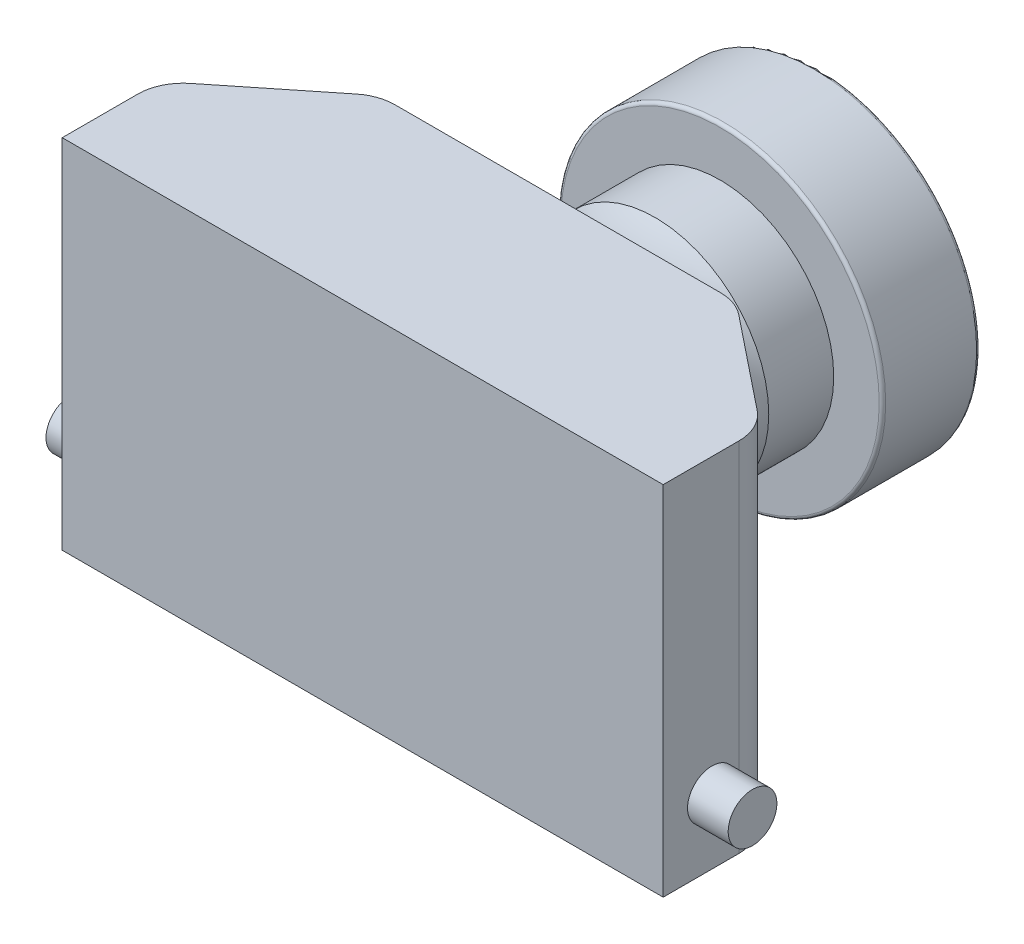
ISO-10303-21;
HEADER;
FILE_DESCRIPTION(('STEP AP214'),'2;1');
FILE_NAME('part.step','',(''),(''),'','','');
FILE_SCHEMA(('AUTOMOTIVE_DESIGN { 1 0 10303 214 1 1 1 1 }'));
ENDSEC;
DATA;
#1=APPLICATION_CONTEXT('core data for automotive mechanical design processes');
#2=APPLICATION_PROTOCOL_DEFINITION('international standard','automotive_design',2000,#1);
#3=PRODUCT_CONTEXT('',#1,'mechanical');
#4=PRODUCT('Part','Part','',(#3));
#5=PRODUCT_RELATED_PRODUCT_CATEGORY('part','',(#4));
#6=PRODUCT_DEFINITION_FORMATION('','',#4);
#7=PRODUCT_DEFINITION_CONTEXT('part definition',#1,'design');
#8=PRODUCT_DEFINITION('design','',#6,#7);
#9=PRODUCT_DEFINITION_SHAPE('','',#8);
#10=(LENGTH_UNIT() NAMED_UNIT(*) SI_UNIT(.MILLI.,.METRE.));
#11=(NAMED_UNIT(*) PLANE_ANGLE_UNIT() SI_UNIT($,.RADIAN.));
#12=(NAMED_UNIT(*) SI_UNIT($,.STERADIAN.) SOLID_ANGLE_UNIT());
#13=UNCERTAINTY_MEASURE_WITH_UNIT(LENGTH_MEASURE(1.E-05),#10,'distance_accuracy_value','');
#14=(GEOMETRIC_REPRESENTATION_CONTEXT(3) GLOBAL_UNCERTAINTY_ASSIGNED_CONTEXT((#13)) GLOBAL_UNIT_ASSIGNED_CONTEXT((#10,
#11,#12)) REPRESENTATION_CONTEXT('',''));
#15=CARTESIAN_POINT('',(0.,0.,0.));
#16=DIRECTION('',(0.,0.,1.));
#17=DIRECTION('',(1.,0.,0.));
#18=AXIS2_PLACEMENT_3D('',#15,#16,#17);
#19=CARTESIAN_POINT('',(9.25,5.5,0.));
#20=DIRECTION('',(-1.,0.,0.));
#21=DIRECTION('',(0.,0.,1.));
#22=AXIS2_PLACEMENT_3D('',#19,#20,#21);
#23=PLANE('',#22);
#24=CARTESIAN_POINT('',(9.25,-3.5,-1.5));
#25=DIRECTION('',(-1.,0.,0.));
#26=DIRECTION('',(0.,0.,1.));
#27=AXIS2_PLACEMENT_3D('',#24,#25,#26);
#28=CIRCLE('',#27,0.75);
#29=CARTESIAN_POINT('',(9.25,-3.5,-0.75));
#30=VERTEX_POINT('',#29);
#31=EDGE_CURVE('E236',#30,#30,#28,.F.);
#32=ORIENTED_EDGE('',*,*,#31,.F.);
#33=EDGE_LOOP('',(#32));
#34=FACE_BOUND('',#33,.T.);
#35=DIRECTION('',(0.,0.,-1.));
#36=VECTOR('',#35,1.);
#37=CARTESIAN_POINT('',(9.25,-5.5,0.));
#38=LINE('',#37,#36);
#39=CARTESIAN_POINT('',(9.25,-5.5,0.));
#40=VERTEX_POINT('',#39);
#41=CARTESIAN_POINT('',(9.25,-5.5,-2.3271252135188));
#42=VERTEX_POINT('',#41);
#43=EDGE_CURVE('E215',#40,#42,#38,.T.);
#44=ORIENTED_EDGE('',*,*,#43,.T.);
#45=DIRECTION('',(0.,-1.,0.));
#46=VECTOR('',#45,1.);
#47=CARTESIAN_POINT('',(9.25,5.5,-2.32712521351881));
#48=LINE('',#47,#46);
#49=CARTESIAN_POINT('',(9.25,5.5,-2.3271252135188));
#50=VERTEX_POINT('',#49);
#51=EDGE_CURVE('E11',#42,#50,#48,.F.);
#52=ORIENTED_EDGE('',*,*,#51,.T.);
#53=DIRECTION('',(0.,0.,-1.));
#54=VECTOR('',#53,1.);
#55=CARTESIAN_POINT('',(9.25,5.5,0.));
#56=LINE('',#55,#54);
#57=CARTESIAN_POINT('',(9.25,5.5,0.));
#58=VERTEX_POINT('',#57);
#59=EDGE_CURVE('E201',#58,#50,#56,.T.);
#60=ORIENTED_EDGE('',*,*,#59,.F.);
#61=DIRECTION('',(0.,-1.,0.));
#62=VECTOR('',#61,1.);
#63=CARTESIAN_POINT('',(9.25,5.5,0.));
#64=LINE('',#63,#62);
#65=EDGE_CURVE('E214',#58,#40,#64,.T.);
#66=ORIENTED_EDGE('',*,*,#65,.T.);
#67=EDGE_LOOP('',(#44,#52,#60,#66));
#68=FACE_BOUND('',#67,.T.);
#69=ADVANCED_FACE('F34',(#34,#68),#23,.F.);
#70=CARTESIAN_POINT('',(9.25,5.5,-3.));
#71=DIRECTION('',(-0.624695047554424,0.,0.780868809443031));
#72=DIRECTION('',(0.780868809443031,0.,0.624695047554424));
#73=AXIS2_PLACEMENT_3D('',#70,#71,#72);
#74=PLANE('',#73);
#75=DIRECTION('',(-0.780868809443031,0.,-0.624695047554424));
#76=VECTOR('',#75,1.);
#77=CARTESIAN_POINT('',(9.25,-5.5,-3.));
#78=LINE('',#77,#76);
#79=CARTESIAN_POINT('',(8.72457306657619,-5.5,-3.42034154673905));
#80=VERTEX_POINT('',#79);
#81=CARTESIAN_POINT('',(5.8834795834747,-5.5,-5.69321633322024));
#82=VERTEX_POINT('',#81);
#83=EDGE_CURVE('E195',#80,#82,#78,.T.);
#84=ORIENTED_EDGE('',*,*,#83,.T.);
#85=DIRECTION('',(0.,-1.,0.));
#86=VECTOR('',#85,1.);
#87=CARTESIAN_POINT('',(5.8834795834747,5.5,-5.69321633322024));
#88=LINE('',#87,#86);
#89=CARTESIAN_POINT('',(5.8834795834747,5.5,-5.69321633322024));
#90=VERTEX_POINT('',#89);
#91=EDGE_CURVE('E42',#82,#90,#88,.F.);
#92=ORIENTED_EDGE('',*,*,#91,.T.);
#93=DIRECTION('',(-0.780868809443031,0.,-0.624695047554424));
#94=VECTOR('',#93,1.);
#95=CARTESIAN_POINT('',(9.25,5.5,-3.));
#96=LINE('',#95,#94);
#97=CARTESIAN_POINT('',(8.72457306657619,5.5,-3.42034154673905));
#98=VERTEX_POINT('',#97);
#99=EDGE_CURVE('E192',#98,#90,#96,.T.);
#100=ORIENTED_EDGE('',*,*,#99,.F.);
#101=DIRECTION('',(0.,-1.,0.));
#102=VECTOR('',#101,1.);
#103=CARTESIAN_POINT('',(8.72457306657619,5.5,-3.42034154673905));
#104=LINE('',#103,#102);
#105=EDGE_CURVE('E188',#98,#80,#104,.T.);
#106=ORIENTED_EDGE('',*,*,#105,.T.);
#107=EDGE_LOOP('',(#84,#92,#100,#106));
#108=FACE_BOUND('',#107,.T.);
#109=ADVANCED_FACE('F132',(#108),#74,.F.);
#110=CARTESIAN_POINT('',(5.5,5.5,-6.));
#111=DIRECTION('',(0.,0.,1.));
#112=DIRECTION('',(1.,0.,0.));
#113=AXIS2_PLACEMENT_3D('',#110,#111,#112);
#114=PLANE('',#113);
#115=CARTESIAN_POINT('',(0.,0.,-6.));
#116=DIRECTION('',(0.,0.,1.));
#117=DIRECTION('',(1.,0.,0.));
#118=AXIS2_PLACEMENT_3D('',#115,#116,#117);
#119=CIRCLE('',#118,4.5);
#120=CARTESIAN_POINT('',(4.5,0.,-6.));
#121=VERTEX_POINT('',#120);
#122=EDGE_CURVE('E218',#121,#121,#119,.T.);
#123=ORIENTED_EDGE('',*,*,#122,.T.);
#124=EDGE_LOOP('',(#123));
#125=FACE_BOUND('',#124,.T.);
#126=DIRECTION('',(-1.,0.,0.));
#127=VECTOR('',#126,1.);
#128=CARTESIAN_POINT('',(5.5,-5.5,-6.));
#129=LINE('',#128,#127);
#130=CARTESIAN_POINT('',(5.0089065168985,-5.5,-6.));
#131=VERTEX_POINT('',#130);
#132=CARTESIAN_POINT('',(-5.0089065168985,-5.5,-6.));
#133=VERTEX_POINT('',#132);
#134=EDGE_CURVE('E220',#131,#133,#129,.T.);
#135=ORIENTED_EDGE('',*,*,#134,.T.);
#136=DIRECTION('',(0.,-1.,0.));
#137=VECTOR('',#136,1.);
#138=CARTESIAN_POINT('',(-5.0089065168985,5.5,-6.));
#139=LINE('',#138,#137);
#140=CARTESIAN_POINT('',(-5.0089065168985,5.5,-6.));
#141=VERTEX_POINT('',#140);
#142=EDGE_CURVE('E49',#133,#141,#139,.F.);
#143=ORIENTED_EDGE('',*,*,#142,.T.);
#144=DIRECTION('',(-1.,0.,0.));
#145=VECTOR('',#144,1.);
#146=CARTESIAN_POINT('',(5.5,5.5,-6.));
#147=LINE('',#146,#145);
#148=CARTESIAN_POINT('',(5.0089065168985,5.5,-6.));
#149=VERTEX_POINT('',#148);
#150=EDGE_CURVE('E200',#149,#141,#147,.T.);
#151=ORIENTED_EDGE('',*,*,#150,.F.);
#152=DIRECTION('',(0.,-1.,0.));
#153=VECTOR('',#152,1.);
#154=CARTESIAN_POINT('',(5.0089065168985,5.5,-6.));
#155=LINE('',#154,#153);
#156=EDGE_CURVE('E175',#149,#131,#155,.T.);
#157=ORIENTED_EDGE('',*,*,#156,.T.);
#158=EDGE_LOOP('',(#135,#143,#151,#157));
#159=FACE_BOUND('',#158,.T.);
#160=ADVANCED_FACE('F138',(#125,#159),#114,.F.);
#161=CARTESIAN_POINT('',(-5.5,5.5,-6.));
#162=DIRECTION('',(0.624695047554424,0.,0.78086880944303));
#163=DIRECTION('',(0.78086880944303,0.,-0.624695047554424));
#164=AXIS2_PLACEMENT_3D('',#161,#162,#163);
#165=PLANE('',#164);
#166=DIRECTION('',(-0.78086880944303,0.,0.624695047554424));
#167=VECTOR('',#166,1.);
#168=CARTESIAN_POINT('',(-5.5,-5.5,-6.));
#169=LINE('',#168,#167);
#170=CARTESIAN_POINT('',(-5.8834795834747,-5.5,-5.69321633322024));
#171=VERTEX_POINT('',#170);
#172=CARTESIAN_POINT('',(-8.72457306657619,-5.5,-3.42034154673904));
#173=VERTEX_POINT('',#172);
#174=EDGE_CURVE('E222',#171,#173,#169,.T.);
#175=ORIENTED_EDGE('',*,*,#174,.T.);
#176=DIRECTION('',(0.,-1.,0.));
#177=VECTOR('',#176,1.);
#178=CARTESIAN_POINT('',(-8.72457306657619,5.5,-3.42034154673904));
#179=LINE('',#178,#177);
#180=CARTESIAN_POINT('',(-8.72457306657619,5.5,-3.42034154673904));
#181=VERTEX_POINT('',#180);
#182=EDGE_CURVE('E181',#173,#181,#179,.F.);
#183=ORIENTED_EDGE('',*,*,#182,.T.);
#184=DIRECTION('',(-0.78086880944303,0.,0.624695047554424));
#185=VECTOR('',#184,1.);
#186=CARTESIAN_POINT('',(-5.5,5.5,-6.));
#187=LINE('',#186,#185);
#188=CARTESIAN_POINT('',(-5.8834795834747,5.5,-5.69321633322024));
#189=VERTEX_POINT('',#188);
#190=EDGE_CURVE('E203',#189,#181,#187,.T.);
#191=ORIENTED_EDGE('',*,*,#190,.F.);
#192=DIRECTION('',(0.,-1.,0.));
#193=VECTOR('',#192,1.);
#194=CARTESIAN_POINT('',(-5.8834795834747,5.5,-5.69321633322024));
#195=LINE('',#194,#193);
#196=EDGE_CURVE('E265',#189,#171,#195,.T.);
#197=ORIENTED_EDGE('',*,*,#196,.T.);
#198=EDGE_LOOP('',(#175,#183,#191,#197));
#199=FACE_BOUND('',#198,.T.);
#200=ADVANCED_FACE('F270',(#199),#165,.F.);
#201=CARTESIAN_POINT('',(-9.25,5.5,-3.));
#202=DIRECTION('',(1.,0.,0.));
#203=DIRECTION('',(0.,0.,-1.));
#204=AXIS2_PLACEMENT_3D('',#201,#202,#203);
#205=PLANE('',#204);
#206=CARTESIAN_POINT('',(-9.25,-3.5,-1.5));
#207=DIRECTION('',(1.,0.,0.));
#208=DIRECTION('',(0.,0.,-1.));
#209=AXIS2_PLACEMENT_3D('',#206,#207,#208);
#210=CIRCLE('',#209,0.75);
#211=CARTESIAN_POINT('',(-9.25,-3.5,-0.75));
#212=VERTEX_POINT('',#211);
#213=EDGE_CURVE('E233',#212,#212,#210,.F.);
#214=ORIENTED_EDGE('',*,*,#213,.F.);
#215=EDGE_LOOP('',(#214));
#216=FACE_BOUND('',#215,.T.);
#217=DIRECTION('',(0.,0.,1.));
#218=VECTOR('',#217,1.);
#219=CARTESIAN_POINT('',(-9.25,5.5,-3.));
#220=LINE('',#219,#218);
#221=CARTESIAN_POINT('',(-9.25,5.5,-2.3271252135188));
#222=VERTEX_POINT('',#221);
#223=CARTESIAN_POINT('',(-9.25,5.5,0.));
#224=VERTEX_POINT('',#223);
#225=EDGE_CURVE('E210',#222,#224,#220,.T.);
#226=ORIENTED_EDGE('',*,*,#225,.F.);
#227=DIRECTION('',(0.,-1.,0.));
#228=VECTOR('',#227,1.);
#229=CARTESIAN_POINT('',(-9.25,5.5,-2.3271252135188));
#230=LINE('',#229,#228);
#231=CARTESIAN_POINT('',(-9.25,-5.5,-2.3271252135188));
#232=VERTEX_POINT('',#231);
#233=EDGE_CURVE('E254',#222,#232,#230,.T.);
#234=ORIENTED_EDGE('',*,*,#233,.T.);
#235=DIRECTION('',(0.,0.,1.));
#236=VECTOR('',#235,1.);
#237=CARTESIAN_POINT('',(-9.25,-5.5,-3.));
#238=LINE('',#237,#236);
#239=CARTESIAN_POINT('',(-9.25,-5.5,0.));
#240=VERTEX_POINT('',#239);
#241=EDGE_CURVE('E225',#232,#240,#238,.T.);
#242=ORIENTED_EDGE('',*,*,#241,.T.);
#243=DIRECTION('',(0.,-1.,0.));
#244=VECTOR('',#243,1.);
#245=CARTESIAN_POINT('',(-9.25,5.5,0.));
#246=LINE('',#245,#244);
#247=EDGE_CURVE('E230',#224,#240,#246,.T.);
#248=ORIENTED_EDGE('',*,*,#247,.F.);
#249=EDGE_LOOP('',(#226,#234,#242,#248));
#250=FACE_BOUND('',#249,.T.);
#251=ADVANCED_FACE('F279',(#216,#250),#205,.F.);
#252=CARTESIAN_POINT('',(-9.25,5.5,0.));
#253=DIRECTION('',(0.,0.,-1.));
#254=DIRECTION('',(-1.,0.,0.));
#255=AXIS2_PLACEMENT_3D('',#252,#253,#254);
#256=PLANE('',#255);
#257=DIRECTION('',(1.,0.,0.));
#258=VECTOR('',#257,1.);
#259=CARTESIAN_POINT('',(-9.25,-5.5,0.));
#260=LINE('',#259,#258);
#261=EDGE_CURVE('E205',#240,#40,#260,.T.);
#262=ORIENTED_EDGE('',*,*,#261,.T.);
#263=ORIENTED_EDGE('',*,*,#65,.F.);
#264=DIRECTION('',(1.,0.,0.));
#265=VECTOR('',#264,1.);
#266=CARTESIAN_POINT('',(-9.25,5.5,0.));
#267=LINE('',#266,#265);
#268=EDGE_CURVE('E212',#224,#58,#267,.T.);
#269=ORIENTED_EDGE('',*,*,#268,.F.);
#270=ORIENTED_EDGE('',*,*,#247,.T.);
#271=EDGE_LOOP('',(#262,#263,#269,#270));
#272=FACE_BOUND('',#271,.T.);
#273=ADVANCED_FACE('F287',(#272),#256,.F.);
#274=CARTESIAN_POINT('',(0.,5.5,0.));
#275=DIRECTION('',(0.,1.,0.));
#276=DIRECTION('',(0.,0.,1.));
#277=AXIS2_PLACEMENT_3D('',#274,#275,#276);
#278=PLANE('',#277);
#279=ORIENTED_EDGE('',*,*,#190,.T.);
#280=CARTESIAN_POINT('',(-7.85,5.5,-2.3271252135188));
#281=DIRECTION('',(0.,1.,0.));
#282=DIRECTION('',(0.,0.,1.));
#283=AXIS2_PLACEMENT_3D('',#280,#281,#282);
#284=CIRCLE('',#283,1.4);
#285=EDGE_CURVE('E179',#181,#222,#284,.T.);
#286=ORIENTED_EDGE('',*,*,#285,.T.);
#287=ORIENTED_EDGE('',*,*,#225,.T.);
#288=ORIENTED_EDGE('',*,*,#268,.T.);
#289=ORIENTED_EDGE('',*,*,#59,.T.);
#290=CARTESIAN_POINT('',(7.85,5.5,-2.32712521351881));
#291=DIRECTION('',(0.,1.,0.));
#292=DIRECTION('',(0.,0.,1.));
#293=AXIS2_PLACEMENT_3D('',#290,#291,#292);
#294=CIRCLE('',#293,1.4);
#295=EDGE_CURVE('E177',#50,#98,#294,.T.);
#296=ORIENTED_EDGE('',*,*,#295,.T.);
#297=ORIENTED_EDGE('',*,*,#99,.T.);
#298=CARTESIAN_POINT('',(5.0089065168985,5.5,-4.6));
#299=DIRECTION('',(0.,1.,0.));
#300=DIRECTION('',(0.,0.,1.));
#301=AXIS2_PLACEMENT_3D('',#298,#299,#300);
#302=CIRCLE('',#301,1.4);
#303=EDGE_CURVE('E56',#90,#149,#302,.T.);
#304=ORIENTED_EDGE('',*,*,#303,.T.);
#305=ORIENTED_EDGE('',*,*,#150,.T.);
#306=CARTESIAN_POINT('',(-5.0089065168985,5.5,-4.6));
#307=DIRECTION('',(0.,1.,0.));
#308=DIRECTION('',(0.,0.,1.));
#309=AXIS2_PLACEMENT_3D('',#306,#307,#308);
#310=CIRCLE('',#309,1.4);
#311=EDGE_CURVE('E176',#141,#189,#310,.T.);
#312=ORIENTED_EDGE('',*,*,#311,.T.);
#313=EDGE_LOOP('',(#279,#286,#287,#288,#289,#296,#297,#304,#305,#312));
#314=FACE_BOUND('',#313,.T.);
#315=ADVANCED_FACE('F197',(#314),#278,.T.);
#316=CARTESIAN_POINT('',(0.,-5.5,0.));
#317=DIRECTION('',(0.,1.,0.));
#318=DIRECTION('',(0.,0.,1.));
#319=AXIS2_PLACEMENT_3D('',#316,#317,#318);
#320=PLANE('',#319);
#321=ORIENTED_EDGE('',*,*,#241,.F.);
#322=CARTESIAN_POINT('',(-7.85,-5.5,-2.3271252135188));
#323=DIRECTION('',(0.,1.,0.));
#324=DIRECTION('',(0.,0.,1.));
#325=AXIS2_PLACEMENT_3D('',#322,#323,#324);
#326=CIRCLE('',#325,1.4);
#327=EDGE_CURVE('E263',#232,#173,#326,.F.);
#328=ORIENTED_EDGE('',*,*,#327,.T.);
#329=ORIENTED_EDGE('',*,*,#174,.F.);
#330=CARTESIAN_POINT('',(-5.0089065168985,-5.5,-4.6));
#331=DIRECTION('',(0.,1.,0.));
#332=DIRECTION('',(0.,0.,1.));
#333=AXIS2_PLACEMENT_3D('',#330,#331,#332);
#334=CIRCLE('',#333,1.4);
#335=EDGE_CURVE('E261',#171,#133,#334,.F.);
#336=ORIENTED_EDGE('',*,*,#335,.T.);
#337=ORIENTED_EDGE('',*,*,#134,.F.);
#338=CARTESIAN_POINT('',(5.0089065168985,-5.5,-4.6));
#339=DIRECTION('',(0.,1.,0.));
#340=DIRECTION('',(0.,0.,1.));
#341=AXIS2_PLACEMENT_3D('',#338,#339,#340);
#342=CIRCLE('',#341,1.4);
#343=EDGE_CURVE('E259',#131,#82,#342,.F.);
#344=ORIENTED_EDGE('',*,*,#343,.T.);
#345=ORIENTED_EDGE('',*,*,#83,.F.);
#346=CARTESIAN_POINT('',(7.85,-5.5,-2.32712521351881));
#347=DIRECTION('',(0.,1.,0.));
#348=DIRECTION('',(0.,0.,1.));
#349=AXIS2_PLACEMENT_3D('',#346,#347,#348);
#350=CIRCLE('',#349,1.4);
#351=EDGE_CURVE('E257',#80,#42,#350,.F.);
#352=ORIENTED_EDGE('',*,*,#351,.T.);
#353=ORIENTED_EDGE('',*,*,#43,.F.);
#354=ORIENTED_EDGE('',*,*,#261,.F.);
#355=EDGE_LOOP('',(#321,#328,#329,#336,#337,#344,#345,#352,#353,#354));
#356=FACE_BOUND('',#355,.T.);
#357=ADVANCED_FACE('F283',(#356),#320,.F.);
#358=CARTESIAN_POINT('',(0.,0.,-8.11237243569579));
#359=DIRECTION('',(0.,0.,1.));
#360=DIRECTION('',(1.,0.,0.));
#361=AXIS2_PLACEMENT_3D('',#358,#359,#360);
#362=TOROIDAL_SURFACE('',#361,5.83711730708738,2.5);
#363=CARTESIAN_POINT('',(0.,0.,-9.));
#364=DIRECTION('',(0.,0.,1.));
#365=DIRECTION('',(1.,0.,0.));
#366=AXIS2_PLACEMENT_3D('',#363,#364,#365);
#367=CIRCLE('',#366,3.5);
#368=CARTESIAN_POINT('',(3.5,0.,-9.));
#369=VERTEX_POINT('',#368);
#370=EDGE_CURVE('E335',#369,#369,#367,.T.);
#371=ORIENTED_EDGE('',*,*,#370,.T.);
#372=EDGE_LOOP('',(#371));
#373=FACE_BOUND('',#372,.T.);
#374=ORIENTED_EDGE('',*,*,#122,.F.);
#375=EDGE_LOOP('',(#374));
#376=FACE_BOUND('',#375,.T.);
#377=ADVANCED_FACE('F307',(#373,#376),#362,.F.);
#378=CARTESIAN_POINT('',(0.,0.,0.));
#379=DIRECTION('',(0.,0.,1.));
#380=DIRECTION('',(1.,0.,0.));
#381=AXIS2_PLACEMENT_3D('',#378,#379,#380);
#382=CYLINDRICAL_SURFACE('',#381,3.5);
#383=CARTESIAN_POINT('',(0.,0.,-11.));
#384=DIRECTION('',(0.,0.,1.));
#385=DIRECTION('',(1.,0.,0.));
#386=AXIS2_PLACEMENT_3D('',#383,#384,#385);
#387=CIRCLE('',#386,3.5);
#388=CARTESIAN_POINT('',(3.5,0.,-11.));
#389=VERTEX_POINT('',#388);
#390=EDGE_CURVE('E334',#389,#389,#387,.T.);
#391=ORIENTED_EDGE('',*,*,#390,.T.);
#392=EDGE_LOOP('',(#391));
#393=FACE_BOUND('',#392,.T.);
#394=ORIENTED_EDGE('',*,*,#370,.F.);
#395=EDGE_LOOP('',(#394));
#396=FACE_BOUND('',#395,.T.);
#397=ADVANCED_FACE('F312',(#393,#396),#382,.T.);
#398=CARTESIAN_POINT('',(5.,0.,-11.));
#399=DIRECTION('',(0.,0.,1.));
#400=DIRECTION('',(1.,0.,0.));
#401=AXIS2_PLACEMENT_3D('',#398,#399,#400);
#402=PLANE('',#401);
#403=CARTESIAN_POINT('',(0.,0.,-11.));
#404=DIRECTION('',(0.,0.,1.));
#405=DIRECTION('',(1.,0.,0.));
#406=AXIS2_PLACEMENT_3D('',#403,#404,#405);
#407=CIRCLE('',#406,4.9);
#408=CARTESIAN_POINT('',(4.9,0.,-11.));
#409=VERTEX_POINT('',#408);
#410=EDGE_CURVE('E245',#409,#409,#407,.T.);
#411=ORIENTED_EDGE('',*,*,#410,.T.);
#412=EDGE_LOOP('',(#411));
#413=FACE_BOUND('',#412,.T.);
#414=ORIENTED_EDGE('',*,*,#390,.F.);
#415=EDGE_LOOP('',(#414));
#416=FACE_BOUND('',#415,.T.);
#417=ADVANCED_FACE('F316',(#413,#416),#402,.T.);
#418=CARTESIAN_POINT('',(0.,0.,0.));
#419=DIRECTION('',(0.,0.,1.));
#420=DIRECTION('',(1.,0.,0.));
#421=AXIS2_PLACEMENT_3D('',#418,#419,#420);
#422=CYLINDRICAL_SURFACE('',#421,5.);
#423=CARTESIAN_POINT('',(0.,0.,-11.1));
#424=DIRECTION('',(0.,0.,1.));
#425=DIRECTION('',(1.,0.,0.));
#426=AXIS2_PLACEMENT_3D('',#423,#424,#425);
#427=CIRCLE('',#426,5.);
#428=CARTESIAN_POINT('',(5.,0.,-11.1));
#429=VERTEX_POINT('',#428);
#430=EDGE_CURVE('E251',#429,#429,#427,.F.);
#431=ORIENTED_EDGE('',*,*,#430,.T.);
#432=EDGE_LOOP('',(#431));
#433=FACE_BOUND('',#432,.T.);
#434=CARTESIAN_POINT('',(0.,0.,-13.9));
#435=DIRECTION('',(0.,0.,-1.));
#436=DIRECTION('',(-1.,0.,0.));
#437=AXIS2_PLACEMENT_3D('',#434,#435,#436);
#438=CIRCLE('',#437,5.);
#439=CARTESIAN_POINT('',(-5.,0.,-13.9));
#440=VERTEX_POINT('',#439);
#441=EDGE_CURVE('E248',#440,#440,#438,.F.);
#442=ORIENTED_EDGE('',*,*,#441,.T.);
#443=EDGE_LOOP('',(#442));
#444=FACE_BOUND('',#443,.T.);
#445=ADVANCED_FACE('F126',(#433,#444),#422,.T.);
#446=CARTESIAN_POINT('',(4.5,0.,-14.));
#447=DIRECTION('',(0.,0.,-1.));
#448=DIRECTION('',(-1.,0.,0.));
#449=AXIS2_PLACEMENT_3D('',#446,#447,#448);
#450=PLANE('',#449);
#451=CARTESIAN_POINT('',(0.,0.,-14.));
#452=DIRECTION('',(0.,0.,-1.));
#453=DIRECTION('',(-1.,0.,0.));
#454=AXIS2_PLACEMENT_3D('',#451,#452,#453);
#455=CIRCLE('',#454,4.76922337333757);
#456=CARTESIAN_POINT('',(-4.76922337333757,0.,-14.));
#457=VERTEX_POINT('',#456);
#458=EDGE_CURVE('E242',#457,#457,#455,.F.);
#459=ORIENTED_EDGE('',*,*,#458,.T.);
#460=EDGE_LOOP('',(#459));
#461=FACE_BOUND('',#460,.T.);
#462=CARTESIAN_POINT('',(0.,0.,-14.));
#463=DIRECTION('',(0.,0.,-1.));
#464=DIRECTION('',(-1.,0.,0.));
#465=AXIS2_PLACEMENT_3D('',#462,#463,#464);
#466=CIRCLE('',#465,4.9);
#467=CARTESIAN_POINT('',(-4.9,0.,-14.));
#468=VERTEX_POINT('',#467);
#469=EDGE_CURVE('E239',#468,#468,#466,.T.);
#470=ORIENTED_EDGE('',*,*,#469,.T.);
#471=EDGE_LOOP('',(#470));
#472=FACE_BOUND('',#471,.T.);
#473=ADVANCED_FACE('F116',(#461,#472),#450,.T.);
#474=CARTESIAN_POINT('',(0.532897604697086,0.,-3.46251702788895));
#475=DIRECTION('',(0.,-1.,0.));
#476=DIRECTION('',(1.,0.,0.));
#477=AXIS2_PLACEMENT_3D('',#474,#475,#476);
#478=CIRCLE('',#477,11.35);
#479=TRIMMED_CURVE('',#478,(PARAMETER_VALUE(-1.61776492487356)),
(PARAMETER_VALUE(1.61776492487356)),.T.,.PARAMETER.);
#480=CARTESIAN_POINT('',(0.,0.,-3.46251702788895));
#481=DIRECTION('',(0.,0.,1.));
#482=AXIS1_PLACEMENT('',#480,#481);
#483=SURFACE_OF_REVOLUTION('',#479,#482);
#484=CARTESIAN_POINT('',(0.,0.,-14.0070962185842));
#485=DIRECTION('',(0.,0.,1.));
#486=DIRECTION('',(1.,0.,0.));
#487=AXIS2_PLACEMENT_3D('',#484,#485,#486);
#488=CIRCLE('',#487,4.73222489500883);
#489=CARTESIAN_POINT('',(4.73222489500883,0.,-14.0070962185842));
#490=VERTEX_POINT('',#489);
#491=EDGE_CURVE('E237',#490,#490,#488,.F.);
#492=ORIENTED_EDGE('',*,*,#491,.T.);
#493=EDGE_LOOP('',(#492));
#494=FACE_BOUND('',#493,.T.);
#495=CARTESIAN_POINT('',(0.,0.,-14.8));
#496=VERTEX_POINT('',#495);
#497=VERTEX_LOOP('',#496);
#498=FACE_BOUND('',#497,.T.);
#499=ADVANCED_FACE('F113',(#494,#498),#483,.T.);
#500=CARTESIAN_POINT('',(-10.5,-3.5,-1.5));
#501=DIRECTION('',(1.,0.,0.));
#502=DIRECTION('',(0.,0.,-1.));
#503=AXIS2_PLACEMENT_3D('',#500,#501,#502);
#504=PLANE('',#503);
#505=CARTESIAN_POINT('',(-10.5,-3.5,-1.5));
#506=DIRECTION('',(1.,0.,0.));
#507=DIRECTION('',(0.,0.,-1.));
#508=AXIS2_PLACEMENT_3D('',#505,#506,#507);
#509=CIRCLE('',#508,0.75);
#510=CARTESIAN_POINT('',(-10.5,-3.5,-0.75));
#511=VERTEX_POINT('',#510);
#512=EDGE_CURVE('E341',#511,#511,#509,.T.);
#513=ORIENTED_EDGE('',*,*,#512,.F.);
#514=EDGE_LOOP('',(#513));
#515=FACE_BOUND('',#514,.T.);
#516=ADVANCED_FACE('F115',(#515),#504,.F.);
#517=CARTESIAN_POINT('',(10.5,-3.5,-1.5));
#518=DIRECTION('',(-1.,0.,0.));
#519=DIRECTION('',(0.,0.,1.));
#520=AXIS2_PLACEMENT_3D('',#517,#518,#519);
#521=CYLINDRICAL_SURFACE('',#520,0.75);
#522=CARTESIAN_POINT('',(-10.5,-3.5,-0.75));
#523=CARTESIAN_POINT('',(-10.4869791666667,-3.5,-0.75));
#524=CARTESIAN_POINT('',(-10.4739583333333,-3.5,-0.75));
#525=CARTESIAN_POINT('',(-10.4479166666667,-3.5,-0.75));
#526=CARTESIAN_POINT('',(-10.4348958333333,-3.5,-0.75));
#527=CARTESIAN_POINT('',(-10.4088541666667,-3.5,-0.75));
#528=CARTESIAN_POINT('',(-10.3958333333333,-3.5,-0.75));
#529=CARTESIAN_POINT('',(-10.3697916666667,-3.5,-0.75));
#530=CARTESIAN_POINT('',(-10.3567708333333,-3.5,-0.75));
#531=CARTESIAN_POINT('',(-10.3307291666667,-3.5,-0.75));
#532=CARTESIAN_POINT('',(-10.3177083333333,-3.5,-0.75));
#533=CARTESIAN_POINT('',(-10.2916666666667,-3.5,-0.75));
#534=CARTESIAN_POINT('',(-10.2786458333333,-3.5,-0.75));
#535=CARTESIAN_POINT('',(-10.2526041666667,-3.5,-0.75));
#536=CARTESIAN_POINT('',(-10.2395833333333,-3.5,-0.75));
#537=CARTESIAN_POINT('',(-10.2135416666667,-3.5,-0.75));
#538=CARTESIAN_POINT('',(-10.2005208333333,-3.5,-0.75));
#539=CARTESIAN_POINT('',(-10.1744791666667,-3.5,-0.75));
#540=CARTESIAN_POINT('',(-10.1614583333333,-3.5,-0.75));
#541=CARTESIAN_POINT('',(-10.1354166666667,-3.5,-0.75));
#542=CARTESIAN_POINT('',(-10.1223958333333,-3.5,-0.75));
#543=CARTESIAN_POINT('',(-10.0963541666667,-3.5,-0.75));
#544=CARTESIAN_POINT('',(-10.0833333333333,-3.5,-0.75));
#545=CARTESIAN_POINT('',(-10.0572916666667,-3.5,-0.75));
#546=CARTESIAN_POINT('',(-10.0442708333333,-3.5,-0.75));
#547=CARTESIAN_POINT('',(-10.0182291666667,-3.5,-0.75));
#548=CARTESIAN_POINT('',(-10.0052083333333,-3.5,-0.75));
#549=CARTESIAN_POINT('',(-9.97916666666667,-3.5,-0.75));
#550=CARTESIAN_POINT('',(-9.96614583333333,-3.5,-0.75));
#551=CARTESIAN_POINT('',(-9.94010416666666,-3.5,-0.75));
#552=CARTESIAN_POINT('',(-9.92708333333333,-3.5,-0.75));
#553=CARTESIAN_POINT('',(-9.90104166666667,-3.5,-0.75));
#554=CARTESIAN_POINT('',(-9.88802083333333,-3.5,-0.75));
#555=CARTESIAN_POINT('',(-9.86197916666667,-3.5,-0.75));
#556=CARTESIAN_POINT('',(-9.84895833333333,-3.5,-0.75));
#557=CARTESIAN_POINT('',(-9.82291666666667,-3.5,-0.75));
#558=CARTESIAN_POINT('',(-9.80989583333334,-3.5,-0.75));
#559=CARTESIAN_POINT('',(-9.78385416666667,-3.5,-0.75));
#560=CARTESIAN_POINT('',(-9.77083333333333,-3.5,-0.75));
#561=CARTESIAN_POINT('',(-9.74479166666667,-3.5,-0.75));
#562=CARTESIAN_POINT('',(-9.73177083333333,-3.5,-0.75));
#563=CARTESIAN_POINT('',(-9.70572916666667,-3.5,-0.75));
#564=CARTESIAN_POINT('',(-9.69270833333333,-3.5,-0.75));
#565=CARTESIAN_POINT('',(-9.66666666666667,-3.5,-0.75));
#566=CARTESIAN_POINT('',(-9.65364583333333,-3.5,-0.75));
#567=CARTESIAN_POINT('',(-9.62760416666666,-3.5,-0.75));
#568=CARTESIAN_POINT('',(-9.61458333333333,-3.5,-0.75));
#569=CARTESIAN_POINT('',(-9.58854166666667,-3.5,-0.75));
#570=CARTESIAN_POINT('',(-9.57552083333333,-3.5,-0.75));
#571=CARTESIAN_POINT('',(-9.54947916666667,-3.5,-0.75));
#572=CARTESIAN_POINT('',(-9.53645833333333,-3.5,-0.75));
#573=CARTESIAN_POINT('',(-9.51041666666667,-3.5,-0.75));
#574=CARTESIAN_POINT('',(-9.49739583333334,-3.5,-0.75));
#575=CARTESIAN_POINT('',(-9.47135416666667,-3.5,-0.75));
#576=CARTESIAN_POINT('',(-9.45833333333333,-3.5,-0.75));
#577=CARTESIAN_POINT('',(-9.43229166666667,-3.5,-0.75));
#578=CARTESIAN_POINT('',(-9.41927083333333,-3.5,-0.75));
#579=CARTESIAN_POINT('',(-9.39322916666667,-3.5,-0.75));
#580=CARTESIAN_POINT('',(-9.38020833333333,-3.5,-0.75));
#581=CARTESIAN_POINT('',(-9.35416666666667,-3.5,-0.75));
#582=CARTESIAN_POINT('',(-9.34114583333333,-3.5,-0.75));
#583=CARTESIAN_POINT('',(-9.31510416666666,-3.5,-0.75));
#584=CARTESIAN_POINT('',(-9.30208333333333,-3.5,-0.75));
#585=CARTESIAN_POINT('',(-9.27604166666666,-3.5,-0.75));
#586=CARTESIAN_POINT('',(-9.26302083333333,-3.5,-0.75));
#587=CARTESIAN_POINT('',(-9.25,-3.5,-0.75));
#588=B_SPLINE_CURVE_WITH_KNOTS('',3,(#522,#523,#524,#525,#526,#527,#528,#529,#530,#531,#532,
#533,#534,#535,#536,#537,#538,#539,#540,#541,#542,#543,#544,#545,#546,#547,#548,#549,#550,#551,
#552,#553,#554,#555,#556,#557,#558,#559,#560,#561,#562,#563,#564,#565,#566,#567,#568,#569,#570,
#571,#572,#573,#574,#575,#576,#577,#578,#579,#580,#581,#582,#583,#584,#585,#586,#587),
.UNSPECIFIED.,.F.,.F.,(4,2,2,2,2,2,2,2,2,2,2,2,2,2,2,2,2,2,2,2,2,2,2,2,2,2,2,2,2,2,2,2,4),(0.,
0.0390624999999992,0.0781249999999983,0.117187500000001,0.15625,0.195312499999999,
0.234375000000002,0.273437500000001,0.3125,0.351562499999999,0.390624999999999,
0.429687500000001,0.46875,0.5078125,0.546875000000002,0.585937500000001,0.625000000000001,
0.6640625,0.703124999999999,0.742187500000002,0.781250000000001,0.8203125,0.859375000000002,
0.898437500000002,0.937500000000001,0.9765625,1.015625,1.0546875,1.09375,1.1328125,1.171875,
1.2109375,1.25),.UNSPECIFIED.);
#589=EDGE_CURVE('BSEAM123',#511,#212,#588,.T.);
#590=ORIENTED_EDGE('',*,*,#512,.T.);
#591=ORIENTED_EDGE('',*,*,#213,.T.);
#592=ORIENTED_EDGE('',*,*,#589,.T.);
#593=ORIENTED_EDGE('',*,*,#589,.F.);
#594=EDGE_LOOP('',(#590,#592,#591,#593));
#595=FACE_BOUND('',#594,.T.);
#596=ADVANCED_FACE('F123',(#595),#521,.T.);
#597=CARTESIAN_POINT('',(10.5,-3.5,-1.5));
#598=DIRECTION('',(1.,0.,0.));
#599=DIRECTION('',(0.,0.,-1.));
#600=AXIS2_PLACEMENT_3D('',#597,#598,#599);
#601=CIRCLE('',#600,0.75);
#602=CARTESIAN_POINT('',(10.5,-3.5,-0.75));
#603=VERTEX_POINT('',#602);
#604=EDGE_CURVE('E336',#603,#603,#601,.T.);
#605=CARTESIAN_POINT('',(10.5,-3.5,-0.75));
#606=CARTESIAN_POINT('',(10.4869791666667,-3.5,-0.75));
#607=CARTESIAN_POINT('',(10.4739583333333,-3.5,-0.75));
#608=CARTESIAN_POINT('',(10.4479166666667,-3.5,-0.75));
#609=CARTESIAN_POINT('',(10.4348958333333,-3.5,-0.75));
#610=CARTESIAN_POINT('',(10.4088541666667,-3.5,-0.75));
#611=CARTESIAN_POINT('',(10.3958333333333,-3.5,-0.75));
#612=CARTESIAN_POINT('',(10.3697916666667,-3.5,-0.75));
#613=CARTESIAN_POINT('',(10.3567708333333,-3.5,-0.75));
#614=CARTESIAN_POINT('',(10.3307291666667,-3.5,-0.75));
#615=CARTESIAN_POINT('',(10.3177083333333,-3.5,-0.75));
#616=CARTESIAN_POINT('',(10.2916666666667,-3.5,-0.75));
#617=CARTESIAN_POINT('',(10.2786458333333,-3.5,-0.75));
#618=CARTESIAN_POINT('',(10.2526041666667,-3.5,-0.75));
#619=CARTESIAN_POINT('',(10.2395833333333,-3.5,-0.75));
#620=CARTESIAN_POINT('',(10.2135416666667,-3.5,-0.75));
#621=CARTESIAN_POINT('',(10.2005208333333,-3.5,-0.75));
#622=CARTESIAN_POINT('',(10.1744791666667,-3.5,-0.75));
#623=CARTESIAN_POINT('',(10.1614583333333,-3.5,-0.75));
#624=CARTESIAN_POINT('',(10.1354166666667,-3.5,-0.75));
#625=CARTESIAN_POINT('',(10.1223958333333,-3.5,-0.75));
#626=CARTESIAN_POINT('',(10.0963541666667,-3.5,-0.75));
#627=CARTESIAN_POINT('',(10.0833333333333,-3.5,-0.75));
#628=CARTESIAN_POINT('',(10.0572916666667,-3.5,-0.75));
#629=CARTESIAN_POINT('',(10.0442708333333,-3.5,-0.75));
#630=CARTESIAN_POINT('',(10.0182291666667,-3.5,-0.75));
#631=CARTESIAN_POINT('',(10.0052083333333,-3.5,-0.75));
#632=CARTESIAN_POINT('',(9.97916666666667,-3.5,-0.75));
#633=CARTESIAN_POINT('',(9.96614583333333,-3.5,-0.75));
#634=CARTESIAN_POINT('',(9.94010416666667,-3.5,-0.75));
#635=CARTESIAN_POINT('',(9.92708333333333,-3.5,-0.75));
#636=CARTESIAN_POINT('',(9.90104166666667,-3.5,-0.75));
#637=CARTESIAN_POINT('',(9.88802083333333,-3.5,-0.75));
#638=CARTESIAN_POINT('',(9.86197916666667,-3.5,-0.75));
#639=CARTESIAN_POINT('',(9.84895833333333,-3.5,-0.75));
#640=CARTESIAN_POINT('',(9.82291666666667,-3.5,-0.75));
#641=CARTESIAN_POINT('',(9.80989583333333,-3.5,-0.75));
#642=CARTESIAN_POINT('',(9.78385416666667,-3.5,-0.75));
#643=CARTESIAN_POINT('',(9.77083333333333,-3.5,-0.75));
#644=CARTESIAN_POINT('',(9.74479166666667,-3.5,-0.75));
#645=CARTESIAN_POINT('',(9.73177083333333,-3.5,-0.75));
#646=CARTESIAN_POINT('',(9.70572916666667,-3.5,-0.75));
#647=CARTESIAN_POINT('',(9.69270833333333,-3.5,-0.75));
#648=CARTESIAN_POINT('',(9.66666666666667,-3.5,-0.75));
#649=CARTESIAN_POINT('',(9.65364583333333,-3.5,-0.75));
#650=CARTESIAN_POINT('',(9.62760416666667,-3.5,-0.75));
#651=CARTESIAN_POINT('',(9.61458333333333,-3.5,-0.75));
#652=CARTESIAN_POINT('',(9.58854166666667,-3.5,-0.75));
#653=CARTESIAN_POINT('',(9.57552083333333,-3.5,-0.75));
#654=CARTESIAN_POINT('',(9.54947916666667,-3.5,-0.75));
#655=CARTESIAN_POINT('',(9.53645833333333,-3.5,-0.75));
#656=CARTESIAN_POINT('',(9.51041666666667,-3.5,-0.75));
#657=CARTESIAN_POINT('',(9.49739583333333,-3.5,-0.75));
#658=CARTESIAN_POINT('',(9.47135416666667,-3.5,-0.75));
#659=CARTESIAN_POINT('',(9.45833333333333,-3.5,-0.75));
#660=CARTESIAN_POINT('',(9.43229166666667,-3.5,-0.75));
#661=CARTESIAN_POINT('',(9.41927083333333,-3.5,-0.75));
#662=CARTESIAN_POINT('',(9.39322916666667,-3.5,-0.75));
#663=CARTESIAN_POINT('',(9.38020833333333,-3.5,-0.75));
#664=CARTESIAN_POINT('',(9.35416666666667,-3.5,-0.75));
#665=CARTESIAN_POINT('',(9.34114583333333,-3.5,-0.75));
#666=CARTESIAN_POINT('',(9.31510416666667,-3.5,-0.75));
#667=CARTESIAN_POINT('',(9.30208333333333,-3.5,-0.75));
#668=CARTESIAN_POINT('',(9.27604166666667,-3.5,-0.75));
#669=CARTESIAN_POINT('',(9.26302083333333,-3.5,-0.75));
#670=CARTESIAN_POINT('',(9.25,-3.5,-0.75));
#671=B_SPLINE_CURVE_WITH_KNOTS('',3,(#605,#606,#607,#608,#609,#610,#611,#612,#613,#614,#615,
#616,#617,#618,#619,#620,#621,#622,#623,#624,#625,#626,#627,#628,#629,#630,#631,#632,#633,#634,
#635,#636,#637,#638,#639,#640,#641,#642,#643,#644,#645,#646,#647,#648,#649,#650,#651,#652,#653,
#654,#655,#656,#657,#658,#659,#660,#661,#662,#663,#664,#665,#666,#667,#668,#669,#670),
.UNSPECIFIED.,.F.,.F.,(4,2,2,2,2,2,2,2,2,2,2,2,2,2,2,2,2,2,2,2,2,2,2,2,2,2,2,2,2,2,2,2,4),(0.,
0.0390624999999992,0.0781249999999983,0.117187499999999,0.156249999999998,0.195312499999999,
0.234374999999998,0.273437499999999,0.312499999999999,0.351562499999999,0.390624999999999,
0.4296875,0.468749999999999,0.5078125,0.546874999999999,0.5859375,0.624999999999999,0.6640625,
0.703124999999999,0.742187499999998,0.781249999999999,0.820312499999998,0.859374999999999,
0.898437499999998,0.937499999999999,0.976562499999998,1.015625,1.0546875,1.09375,1.1328125,
1.171875,1.2109375,1.25),.UNSPECIFIED.);
#672=EDGE_CURVE('BSEAM353',#603,#30,#671,.T.);
#673=ORIENTED_EDGE('',*,*,#604,.F.);
#674=ORIENTED_EDGE('',*,*,#31,.T.);
#675=ORIENTED_EDGE('',*,*,#672,.T.);
#676=ORIENTED_EDGE('',*,*,#672,.F.);
#677=EDGE_LOOP('',(#673,#675,#674,#676));
#678=FACE_BOUND('',#677,.T.);
#679=ADVANCED_FACE('F353',(#678),#521,.T.);
#680=CARTESIAN_POINT('',(10.5,-3.5,-1.5));
#681=DIRECTION('',(1.,0.,0.));
#682=DIRECTION('',(0.,0.,-1.));
#683=AXIS2_PLACEMENT_3D('',#680,#681,#682);
#684=PLANE('',#683);
#685=ORIENTED_EDGE('',*,*,#604,.T.);
#686=EDGE_LOOP('',(#685));
#687=FACE_BOUND('',#686,.T.);
#688=ADVANCED_FACE('F149',(#687),#684,.T.);
#689=CARTESIAN_POINT('',(0.,0.,-14.1));
#690=DIRECTION('',(0.,0.,-1.));
#691=DIRECTION('',(-1.,0.,0.));
#692=AXIS2_PLACEMENT_3D('',#689,#690,#691);
#693=TOROIDAL_SURFACE('',#692,4.76922337333757,0.1);
#694=ORIENTED_EDGE('',*,*,#458,.F.);
#695=EDGE_LOOP('',(#694));
#696=FACE_BOUND('',#695,.T.);
#697=ORIENTED_EDGE('',*,*,#491,.F.);
#698=EDGE_LOOP('',(#697));
#699=FACE_BOUND('',#698,.T.);
#700=ADVANCED_FACE('F145',(#696,#699),#693,.F.);
#701=CARTESIAN_POINT('',(0.,0.,-11.1));
#702=DIRECTION('',(0.,0.,1.));
#703=DIRECTION('',(1.,0.,0.));
#704=AXIS2_PLACEMENT_3D('',#701,#702,#703);
#705=TOROIDAL_SURFACE('',#704,4.9,0.1);
#706=ORIENTED_EDGE('',*,*,#430,.F.);
#707=EDGE_LOOP('',(#706));
#708=FACE_BOUND('',#707,.T.);
#709=ORIENTED_EDGE('',*,*,#410,.F.);
#710=EDGE_LOOP('',(#709));
#711=FACE_BOUND('',#710,.T.);
#712=ADVANCED_FACE('F148',(#708,#711),#705,.T.);
#713=CARTESIAN_POINT('',(0.,0.,-13.9));
#714=DIRECTION('',(0.,0.,-1.));
#715=DIRECTION('',(-1.,0.,0.));
#716=AXIS2_PLACEMENT_3D('',#713,#714,#715);
#717=TOROIDAL_SURFACE('',#716,4.9,0.1);
#718=ORIENTED_EDGE('',*,*,#469,.F.);
#719=EDGE_LOOP('',(#718));
#720=FACE_BOUND('',#719,.T.);
#721=ORIENTED_EDGE('',*,*,#441,.F.);
#722=EDGE_LOOP('',(#721));
#723=FACE_BOUND('',#722,.T.);
#724=ADVANCED_FACE('F153',(#720,#723),#717,.T.);
#725=CARTESIAN_POINT('',(-7.85,5.5,-2.3271252135188));
#726=DIRECTION('',(0.,-1.,0.));
#727=DIRECTION('',(0.,0.,-1.));
#728=AXIS2_PLACEMENT_3D('',#725,#726,#727);
#729=CYLINDRICAL_SURFACE('',#728,1.4);
#730=ORIENTED_EDGE('',*,*,#285,.F.);
#731=ORIENTED_EDGE('',*,*,#182,.F.);
#732=ORIENTED_EDGE('',*,*,#327,.F.);
#733=ORIENTED_EDGE('',*,*,#233,.F.);
#734=EDGE_LOOP('',(#730,#731,#732,#733));
#735=FACE_BOUND('',#734,.T.);
#736=ADVANCED_FACE('F157',(#735),#729,.T.);
#737=CARTESIAN_POINT('',(-5.0089065168985,5.5,-4.6));
#738=DIRECTION('',(0.,-1.,0.));
#739=DIRECTION('',(0.,0.,-1.));
#740=AXIS2_PLACEMENT_3D('',#737,#738,#739);
#741=CYLINDRICAL_SURFACE('',#740,1.4);
#742=ORIENTED_EDGE('',*,*,#311,.F.);
#743=ORIENTED_EDGE('',*,*,#142,.F.);
#744=ORIENTED_EDGE('',*,*,#335,.F.);
#745=ORIENTED_EDGE('',*,*,#196,.F.);
#746=EDGE_LOOP('',(#742,#743,#744,#745));
#747=FACE_BOUND('',#746,.T.);
#748=ADVANCED_FACE('F161',(#747),#741,.T.);
#749=CARTESIAN_POINT('',(5.0089065168985,5.5,-4.6));
#750=DIRECTION('',(0.,-1.,0.));
#751=DIRECTION('',(0.,0.,-1.));
#752=AXIS2_PLACEMENT_3D('',#749,#750,#751);
#753=CYLINDRICAL_SURFACE('',#752,1.4);
#754=ORIENTED_EDGE('',*,*,#303,.F.);
#755=ORIENTED_EDGE('',*,*,#91,.F.);
#756=ORIENTED_EDGE('',*,*,#343,.F.);
#757=ORIENTED_EDGE('',*,*,#156,.F.);
#758=EDGE_LOOP('',(#754,#755,#756,#757));
#759=FACE_BOUND('',#758,.T.);
#760=ADVANCED_FACE('F164',(#759),#753,.T.);
#761=CARTESIAN_POINT('',(7.85,5.5,-2.32712521351881));
#762=DIRECTION('',(0.,-1.,0.));
#763=DIRECTION('',(0.,0.,-1.));
#764=AXIS2_PLACEMENT_3D('',#761,#762,#763);
#765=CYLINDRICAL_SURFACE('',#764,1.4);
#766=ORIENTED_EDGE('',*,*,#295,.F.);
#767=ORIENTED_EDGE('',*,*,#51,.F.);
#768=ORIENTED_EDGE('',*,*,#351,.F.);
#769=ORIENTED_EDGE('',*,*,#105,.F.);
#770=EDGE_LOOP('',(#766,#767,#768,#769));
#771=FACE_BOUND('',#770,.T.);
#772=ADVANCED_FACE('F36',(#771),#765,.T.);
#773=CLOSED_SHELL('',(#69,#109,#160,#200,#251,#273,#315,#357,#377,#397,#417,#445,#473,#499,#516,
#596,#679,#688,#700,#712,#724,#736,#748,#760,#772));
#774=MANIFOLD_SOLID_BREP('B2',#773);
#775=ADVANCED_BREP_SHAPE_REPRESENTATION('',(#18,#774),#14);
#776=SHAPE_DEFINITION_REPRESENTATION(#9,#775);
ENDSEC;
END-ISO-10303-21;
